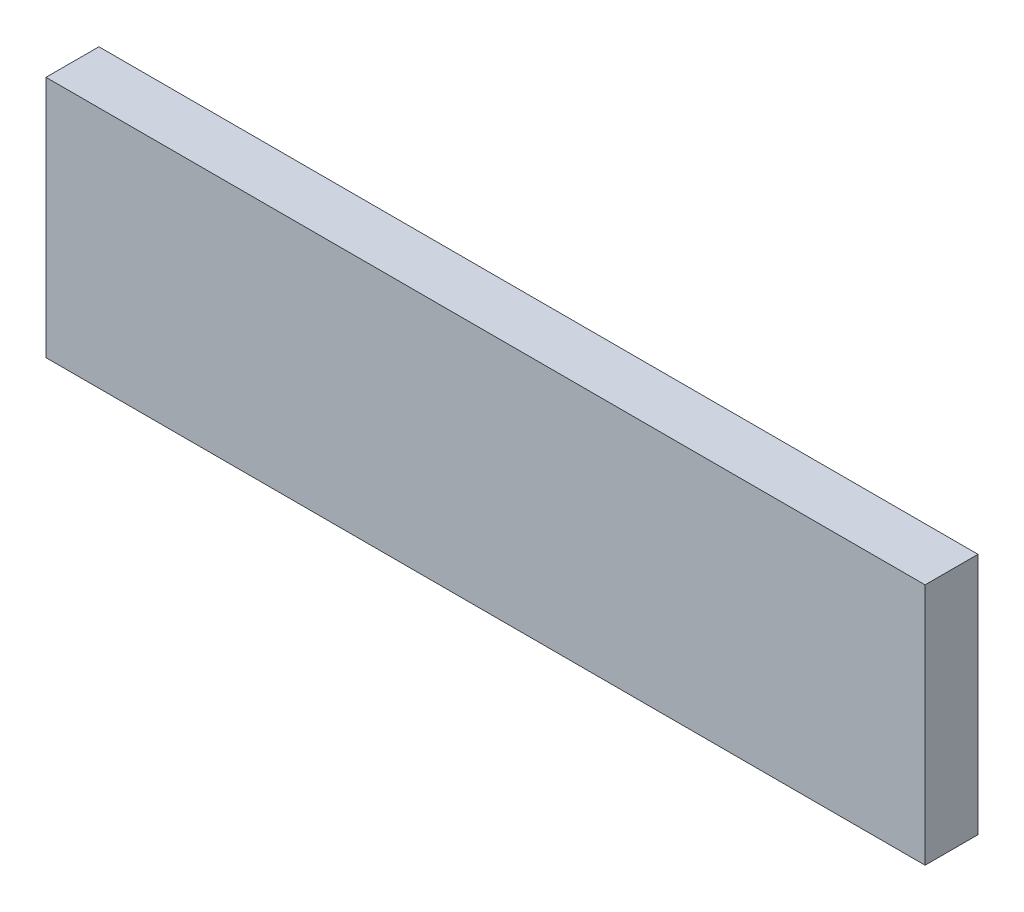
ISO-10303-21;
HEADER;
FILE_DESCRIPTION(('STEP AP214'),'2;1');
FILE_NAME('part.step','',(''),(''),'','','');
FILE_SCHEMA(('AUTOMOTIVE_DESIGN { 1 0 10303 214 1 1 1 1 }'));
ENDSEC;
DATA;
#1=APPLICATION_CONTEXT('core data for automotive mechanical design processes');
#2=APPLICATION_PROTOCOL_DEFINITION('international standard','automotive_design',2000,#1);
#3=PRODUCT_CONTEXT('',#1,'mechanical');
#4=PRODUCT('Part','Part','',(#3));
#5=PRODUCT_RELATED_PRODUCT_CATEGORY('part','',(#4));
#6=PRODUCT_DEFINITION_FORMATION('','',#4);
#7=PRODUCT_DEFINITION_CONTEXT('part definition',#1,'design');
#8=PRODUCT_DEFINITION('design','',#6,#7);
#9=PRODUCT_DEFINITION_SHAPE('','',#8);
#10=(LENGTH_UNIT() NAMED_UNIT(*) SI_UNIT(.MILLI.,.METRE.));
#11=(NAMED_UNIT(*) PLANE_ANGLE_UNIT() SI_UNIT($,.RADIAN.));
#12=(NAMED_UNIT(*) SI_UNIT($,.STERADIAN.) SOLID_ANGLE_UNIT());
#13=UNCERTAINTY_MEASURE_WITH_UNIT(LENGTH_MEASURE(1.E-05),#10,'distance_accuracy_value','');
#14=(GEOMETRIC_REPRESENTATION_CONTEXT(3) GLOBAL_UNCERTAINTY_ASSIGNED_CONTEXT((#13)) GLOBAL_UNIT_ASSIGNED_CONTEXT((#10,
#11,#12)) REPRESENTATION_CONTEXT('',''));
#15=CARTESIAN_POINT('',(0.,0.,0.));
#16=DIRECTION('',(0.,0.,1.));
#17=DIRECTION('',(1.,0.,0.));
#18=AXIS2_PLACEMENT_3D('',#15,#16,#17);
#19=CARTESIAN_POINT('',(702.,1469.,-797.5));
#20=DIRECTION('',(-1.,0.,0.));
#21=DIRECTION('',(0.,0.,1.));
#22=AXIS2_PLACEMENT_3D('',#19,#20,#21);
#23=PLANE('',#22);
#24=DIRECTION('',(0.,-1.,0.));
#25=VECTOR('',#24,1.);
#26=CARTESIAN_POINT('',(702.,1469.,-758.5));
#27=LINE('',#26,#25);
#28=CARTESIAN_POINT('',(702.,1648.,-758.5));
#29=VERTEX_POINT('',#28);
#30=CARTESIAN_POINT('',(702.,1469.,-758.5));
#31=VERTEX_POINT('',#30);
#32=EDGE_CURVE('E103',#29,#31,#27,.T.);
#33=ORIENTED_EDGE('',*,*,#32,.F.);
#34=DIRECTION('',(0.,0.,1.));
#35=VECTOR('',#34,1.);
#36=CARTESIAN_POINT('',(702.,1648.,-797.5));
#37=LINE('',#36,#35);
#38=CARTESIAN_POINT('',(702.,1648.,-797.5));
#39=VERTEX_POINT('',#38);
#40=EDGE_CURVE('E11',#39,#29,#37,.T.);
#41=ORIENTED_EDGE('',*,*,#40,.F.);
#42=DIRECTION('',(0.,-1.,0.));
#43=VECTOR('',#42,1.);
#44=CARTESIAN_POINT('',(702.,1469.,-797.5));
#45=LINE('',#44,#43);
#46=CARTESIAN_POINT('',(702.,1469.,-797.5));
#47=VERTEX_POINT('',#46);
#48=EDGE_CURVE('E97',#39,#47,#45,.T.);
#49=ORIENTED_EDGE('',*,*,#48,.T.);
#50=DIRECTION('',(0.,0.,1.));
#51=VECTOR('',#50,1.);
#52=CARTESIAN_POINT('',(702.,1469.,-797.5));
#53=LINE('',#52,#51);
#54=EDGE_CURVE('E42',#47,#31,#53,.T.);
#55=ORIENTED_EDGE('',*,*,#54,.T.);
#56=EDGE_LOOP('',(#33,#41,#49,#55));
#57=FACE_BOUND('',#56,.T.);
#58=ADVANCED_FACE('F39',(#57),#23,.T.);
#59=CARTESIAN_POINT('',(702.,1648.,-797.5));
#60=DIRECTION('',(0.,1.,0.));
#61=DIRECTION('',(0.,0.,1.));
#62=AXIS2_PLACEMENT_3D('',#59,#60,#61);
#63=PLANE('',#62);
#64=DIRECTION('',(-1.,0.,0.));
#65=VECTOR('',#64,1.);
#66=CARTESIAN_POINT('',(702.,1648.,-758.5));
#67=LINE('',#66,#65);
#68=CARTESIAN_POINT('',(1350.,1648.,-758.5));
#69=VERTEX_POINT('',#68);
#70=EDGE_CURVE('E99',#69,#29,#67,.T.);
#71=ORIENTED_EDGE('',*,*,#70,.F.);
#72=DIRECTION('',(0.,0.,1.));
#73=VECTOR('',#72,1.);
#74=CARTESIAN_POINT('',(1350.,1648.,-797.5));
#75=LINE('',#74,#73);
#76=CARTESIAN_POINT('',(1350.,1648.,-797.5));
#77=VERTEX_POINT('',#76);
#78=EDGE_CURVE('E48',#77,#69,#75,.T.);
#79=ORIENTED_EDGE('',*,*,#78,.F.);
#80=DIRECTION('',(-1.,0.,0.));
#81=VECTOR('',#80,1.);
#82=CARTESIAN_POINT('',(702.,1648.,-797.5));
#83=LINE('',#82,#81);
#84=EDGE_CURVE('E94',#77,#39,#83,.T.);
#85=ORIENTED_EDGE('',*,*,#84,.T.);
#86=ORIENTED_EDGE('',*,*,#40,.T.);
#87=EDGE_LOOP('',(#71,#79,#85,#86));
#88=FACE_BOUND('',#87,.T.);
#89=ADVANCED_FACE('F113',(#88),#63,.T.);
#90=CARTESIAN_POINT('',(1350.,1469.,-797.5));
#91=DIRECTION('',(1.,0.,0.));
#92=DIRECTION('',(0.,0.,-1.));
#93=AXIS2_PLACEMENT_3D('',#90,#91,#92);
#94=PLANE('',#93);
#95=DIRECTION('',(0.,1.,0.));
#96=VECTOR('',#95,1.);
#97=CARTESIAN_POINT('',(1350.,1469.,-758.5));
#98=LINE('',#97,#96);
#99=CARTESIAN_POINT('',(1350.,1469.,-758.5));
#100=VERTEX_POINT('',#99);
#101=EDGE_CURVE('E89',#100,#69,#98,.T.);
#102=ORIENTED_EDGE('',*,*,#101,.F.);
#103=DIRECTION('',(0.,0.,1.));
#104=VECTOR('',#103,1.);
#105=CARTESIAN_POINT('',(1350.,1469.,-797.5));
#106=LINE('',#105,#104);
#107=CARTESIAN_POINT('',(1350.,1469.,-797.5));
#108=VERTEX_POINT('',#107);
#109=EDGE_CURVE('E84',#108,#100,#106,.T.);
#110=ORIENTED_EDGE('',*,*,#109,.F.);
#111=DIRECTION('',(0.,1.,0.));
#112=VECTOR('',#111,1.);
#113=CARTESIAN_POINT('',(1350.,1469.,-797.5));
#114=LINE('',#113,#112);
#115=EDGE_CURVE('E87',#108,#77,#114,.T.);
#116=ORIENTED_EDGE('',*,*,#115,.T.);
#117=ORIENTED_EDGE('',*,*,#78,.T.);
#118=EDGE_LOOP('',(#102,#110,#116,#117));
#119=FACE_BOUND('',#118,.T.);
#120=ADVANCED_FACE('F86',(#119),#94,.T.);
#121=CARTESIAN_POINT('',(702.,1469.,-797.5));
#122=DIRECTION('',(0.,-1.,0.));
#123=DIRECTION('',(0.,0.,-1.));
#124=AXIS2_PLACEMENT_3D('',#121,#122,#123);
#125=PLANE('',#124);
#126=DIRECTION('',(1.,0.,0.));
#127=VECTOR('',#126,1.);
#128=CARTESIAN_POINT('',(702.,1469.,-758.5));
#129=LINE('',#128,#127);
#130=EDGE_CURVE('E106',#31,#100,#129,.T.);
#131=ORIENTED_EDGE('',*,*,#130,.F.);
#132=ORIENTED_EDGE('',*,*,#54,.F.);
#133=DIRECTION('',(1.,0.,0.));
#134=VECTOR('',#133,1.);
#135=CARTESIAN_POINT('',(702.,1469.,-797.5));
#136=LINE('',#135,#134);
#137=EDGE_CURVE('E93',#47,#108,#136,.T.);
#138=ORIENTED_EDGE('',*,*,#137,.T.);
#139=ORIENTED_EDGE('',*,*,#109,.T.);
#140=EDGE_LOOP('',(#131,#132,#138,#139));
#141=FACE_BOUND('',#140,.T.);
#142=ADVANCED_FACE('F96',(#141),#125,.T.);
#143=CARTESIAN_POINT('',(0.,0.,-797.5));
#144=DIRECTION('',(0.,0.,-1.));
#145=DIRECTION('',(-1.,0.,0.));
#146=AXIS2_PLACEMENT_3D('',#143,#144,#145);
#147=PLANE('',#146);
#148=ORIENTED_EDGE('',*,*,#48,.F.);
#149=ORIENTED_EDGE('',*,*,#84,.F.);
#150=ORIENTED_EDGE('',*,*,#115,.F.);
#151=ORIENTED_EDGE('',*,*,#137,.F.);
#152=EDGE_LOOP('',(#148,#149,#150,#151));
#153=FACE_BOUND('',#152,.T.);
#154=ADVANCED_FACE('F92',(#153),#147,.T.);
#155=CARTESIAN_POINT('',(0.,0.,-758.5));
#156=DIRECTION('',(0.,0.,-1.));
#157=DIRECTION('',(-1.,0.,0.));
#158=AXIS2_PLACEMENT_3D('',#155,#156,#157);
#159=PLANE('',#158);
#160=ORIENTED_EDGE('',*,*,#32,.T.);
#161=ORIENTED_EDGE('',*,*,#130,.T.);
#162=ORIENTED_EDGE('',*,*,#101,.T.);
#163=ORIENTED_EDGE('',*,*,#70,.T.);
#164=EDGE_LOOP('',(#160,#161,#162,#163));
#165=FACE_BOUND('',#164,.T.);
#166=ADVANCED_FACE('F112',(#165),#159,.F.);
#167=CLOSED_SHELL('',(#58,#89,#120,#142,#154,#166));
#168=MANIFOLD_SOLID_BREP('B2',#167);
#169=ADVANCED_BREP_SHAPE_REPRESENTATION('',(#18,#168),#14);
#170=SHAPE_DEFINITION_REPRESENTATION(#9,#169);
ENDSEC;
END-ISO-10303-21;
